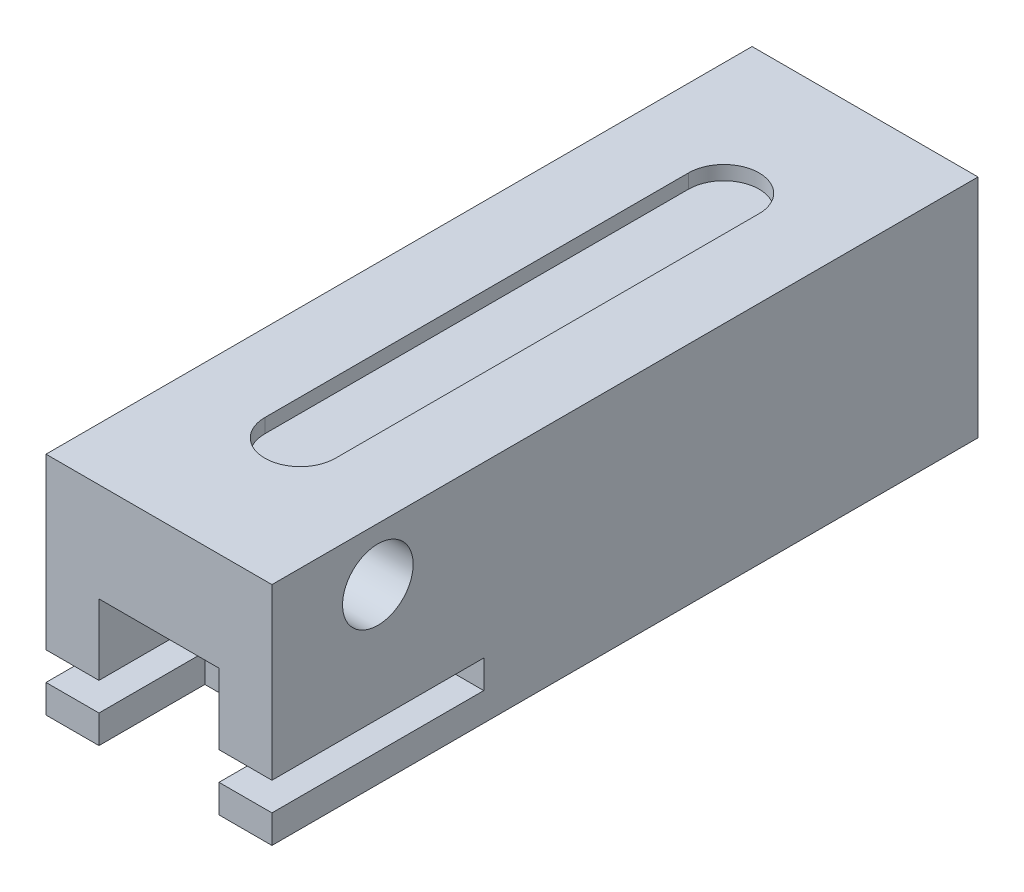
ISO-10303-21;
HEADER;
FILE_DESCRIPTION(('STEP AP214'),'2;1');
FILE_NAME('part.step','',(''),(''),'','','');
FILE_SCHEMA(('AUTOMOTIVE_DESIGN { 1 0 10303 214 1 1 1 1 }'));
ENDSEC;
DATA;
#1=APPLICATION_CONTEXT('core data for automotive mechanical design processes');
#2=APPLICATION_PROTOCOL_DEFINITION('international standard','automotive_design',2000,#1);
#3=PRODUCT_CONTEXT('',#1,'mechanical');
#4=PRODUCT('Part','Part','',(#3));
#5=PRODUCT_RELATED_PRODUCT_CATEGORY('part','',(#4));
#6=PRODUCT_DEFINITION_FORMATION('','',#4);
#7=PRODUCT_DEFINITION_CONTEXT('part definition',#1,'design');
#8=PRODUCT_DEFINITION('design','',#6,#7);
#9=PRODUCT_DEFINITION_SHAPE('','',#8);
#10=(LENGTH_UNIT() NAMED_UNIT(*) SI_UNIT(.MILLI.,.METRE.));
#11=(NAMED_UNIT(*) PLANE_ANGLE_UNIT() SI_UNIT($,.RADIAN.));
#12=(NAMED_UNIT(*) SI_UNIT($,.STERADIAN.) SOLID_ANGLE_UNIT());
#13=UNCERTAINTY_MEASURE_WITH_UNIT(LENGTH_MEASURE(1.E-05),#10,'distance_accuracy_value','');
#14=(GEOMETRIC_REPRESENTATION_CONTEXT(3) GLOBAL_UNCERTAINTY_ASSIGNED_CONTEXT((#13)) GLOBAL_UNIT_ASSIGNED_CONTEXT((#10,
#11,#12)) REPRESENTATION_CONTEXT('',''));
#15=CARTESIAN_POINT('',(0.,0.,0.));
#16=DIRECTION('',(0.,0.,1.));
#17=DIRECTION('',(1.,0.,0.));
#18=AXIS2_PLACEMENT_3D('',#15,#16,#17);
#19=CARTESIAN_POINT('',(-16.,-16.,-100.));
#20=DIRECTION('',(0.,-1.,0.));
#21=DIRECTION('',(0.,0.,-1.));
#22=AXIS2_PLACEMENT_3D('',#19,#20,#21);
#23=PLANE('',#22);
#24=DIRECTION('',(1.,0.,0.));
#25=VECTOR('',#24,1.);
#26=CARTESIAN_POINT('',(-16.,-16.,0.));
#27=LINE('',#26,#25);
#28=CARTESIAN_POINT('',(8.5,-16.,0.));
#29=VERTEX_POINT('',#28);
#30=CARTESIAN_POINT('',(16.,-16.,0.));
#31=VERTEX_POINT('',#30);
#32=EDGE_CURVE('E318',#29,#31,#27,.T.);
#33=ORIENTED_EDGE('',*,*,#32,.F.);
#34=DIRECTION('',(0.,0.,-1.));
#35=VECTOR('',#34,1.);
#36=CARTESIAN_POINT('',(8.5,-16.,-100.));
#37=LINE('',#36,#35);
#38=CARTESIAN_POINT('',(8.5,-16.,-15.));
#39=VERTEX_POINT('',#38);
#40=EDGE_CURVE('E208',#29,#39,#37,.T.);
#41=ORIENTED_EDGE('',*,*,#40,.T.);
#42=DIRECTION('',(-1.,0.,0.));
#43=VECTOR('',#42,1.);
#44=CARTESIAN_POINT('',(-16.,-16.,-15.));
#45=LINE('',#44,#43);
#46=CARTESIAN_POINT('',(-8.5,-16.,-15.));
#47=VERTEX_POINT('',#46);
#48=EDGE_CURVE('E201',#39,#47,#45,.T.);
#49=ORIENTED_EDGE('',*,*,#48,.T.);
#50=DIRECTION('',(0.,0.,-1.));
#51=VECTOR('',#50,1.);
#52=CARTESIAN_POINT('',(-8.5,-16.,-100.));
#53=LINE('',#52,#51);
#54=CARTESIAN_POINT('',(-8.5,-16.,0.));
#55=VERTEX_POINT('',#54);
#56=EDGE_CURVE('E194',#55,#47,#53,.T.);
#57=ORIENTED_EDGE('',*,*,#56,.F.);
#58=CARTESIAN_POINT('',(-16.,-16.,0.));
#59=VERTEX_POINT('',#58);
#60=EDGE_CURVE('E299',#59,#55,#27,.T.);
#61=ORIENTED_EDGE('',*,*,#60,.F.);
#62=DIRECTION('',(0.,0.,1.));
#63=VECTOR('',#62,1.);
#64=CARTESIAN_POINT('',(-16.,-16.,-100.));
#65=LINE('',#64,#63);
#66=CARTESIAN_POINT('',(-16.,-16.,-100.));
#67=VERTEX_POINT('',#66);
#68=EDGE_CURVE('E46',#67,#59,#65,.T.);
#69=ORIENTED_EDGE('',*,*,#68,.F.);
#70=DIRECTION('',(1.,0.,0.));
#71=VECTOR('',#70,1.);
#72=CARTESIAN_POINT('',(-16.,-16.,-100.));
#73=LINE('',#72,#71);
#74=CARTESIAN_POINT('',(16.,-16.,-100.));
#75=VERTEX_POINT('',#74);
#76=EDGE_CURVE('E305',#67,#75,#73,.T.);
#77=ORIENTED_EDGE('',*,*,#76,.T.);
#78=DIRECTION('',(0.,0.,1.));
#79=VECTOR('',#78,1.);
#80=CARTESIAN_POINT('',(16.,-16.,-100.));
#81=LINE('',#80,#79);
#82=EDGE_CURVE('E11',#75,#31,#81,.T.);
#83=ORIENTED_EDGE('',*,*,#82,.T.);
#84=EDGE_LOOP('',(#33,#41,#49,#57,#61,#69,#77,#83));
#85=FACE_BOUND('',#84,.T.);
#86=ADVANCED_FACE('F37',(#85),#23,.T.);
#87=CARTESIAN_POINT('',(0.,0.,0.));
#88=DIRECTION('',(0.,0.,-1.));
#89=DIRECTION('',(-1.,0.,0.));
#90=AXIS2_PLACEMENT_3D('',#87,#88,#89);
#91=PLANE('',#90);
#92=DIRECTION('',(0.,-1.,0.));
#93=VECTOR('',#92,1.);
#94=CARTESIAN_POINT('',(8.5,0.,0.));
#95=LINE('',#94,#93);
#96=CARTESIAN_POINT('',(8.5,-12.,0.));
#97=VERTEX_POINT('',#96);
#98=EDGE_CURVE('E187',#97,#29,#95,.T.);
#99=ORIENTED_EDGE('',*,*,#98,.T.);
#100=ORIENTED_EDGE('',*,*,#32,.T.);
#101=DIRECTION('',(0.,1.,0.));
#102=VECTOR('',#101,1.);
#103=CARTESIAN_POINT('',(16.,-16.,0.));
#104=LINE('',#103,#102);
#105=CARTESIAN_POINT('',(16.,-12.,0.));
#106=VERTEX_POINT('',#105);
#107=EDGE_CURVE('E308',#31,#106,#104,.T.);
#108=ORIENTED_EDGE('',*,*,#107,.T.);
#109=DIRECTION('',(1.,0.,0.));
#110=VECTOR('',#109,1.);
#111=CARTESIAN_POINT('',(0.,-12.,0.));
#112=LINE('',#111,#110);
#113=EDGE_CURVE('E237',#97,#106,#112,.T.);
#114=ORIENTED_EDGE('',*,*,#113,.F.);
#115=EDGE_LOOP('',(#99,#100,#108,#114));
#116=FACE_BOUND('',#115,.T.);
#117=ADVANCED_FACE('F354',(#116),#91,.F.);
#118=CARTESIAN_POINT('',(0.,-12.,-30.));
#119=DIRECTION('',(0.,-1.,0.));
#120=DIRECTION('',(0.,0.,-1.));
#121=AXIS2_PLACEMENT_3D('',#118,#119,#120);
#122=PLANE('',#121);
#123=DIRECTION('',(0.,0.,1.));
#124=VECTOR('',#123,1.);
#125=CARTESIAN_POINT('',(8.5,-12.,-15.));
#126=LINE('',#125,#124);
#127=CARTESIAN_POINT('',(8.5,-12.,-15.));
#128=VERTEX_POINT('',#127);
#129=EDGE_CURVE('E54',#128,#97,#126,.T.);
#130=ORIENTED_EDGE('',*,*,#129,.T.);
#131=ORIENTED_EDGE('',*,*,#113,.T.);
#132=DIRECTION('',(0.,0.,1.));
#133=VECTOR('',#132,1.);
#134=CARTESIAN_POINT('',(16.,-12.,-30.));
#135=LINE('',#134,#133);
#136=CARTESIAN_POINT('',(16.,-12.,-30.));
#137=VERTEX_POINT('',#136);
#138=EDGE_CURVE('E254',#137,#106,#135,.T.);
#139=ORIENTED_EDGE('',*,*,#138,.F.);
#140=DIRECTION('',(1.,0.,0.));
#141=VECTOR('',#140,1.);
#142=CARTESIAN_POINT('',(0.,-12.,-30.));
#143=LINE('',#142,#141);
#144=CARTESIAN_POINT('',(-16.,-12.,-30.));
#145=VERTEX_POINT('',#144);
#146=EDGE_CURVE('E221',#145,#137,#143,.T.);
#147=ORIENTED_EDGE('',*,*,#146,.F.);
#148=DIRECTION('',(0.,0.,1.));
#149=VECTOR('',#148,1.);
#150=CARTESIAN_POINT('',(-16.,-12.,-30.));
#151=LINE('',#150,#149);
#152=CARTESIAN_POINT('',(-16.,-12.,0.));
#153=VERTEX_POINT('',#152);
#154=EDGE_CURVE('E257',#145,#153,#151,.T.);
#155=ORIENTED_EDGE('',*,*,#154,.T.);
#156=CARTESIAN_POINT('',(-8.5,-12.,0.));
#157=VERTEX_POINT('',#156);
#158=EDGE_CURVE('E199',#153,#157,#112,.T.);
#159=ORIENTED_EDGE('',*,*,#158,.T.);
#160=DIRECTION('',(0.,0.,1.));
#161=VECTOR('',#160,1.);
#162=CARTESIAN_POINT('',(-8.5,-12.,-15.));
#163=LINE('',#162,#161);
#164=CARTESIAN_POINT('',(-8.5,-12.,-15.));
#165=VERTEX_POINT('',#164);
#166=EDGE_CURVE('E191',#165,#157,#163,.T.);
#167=ORIENTED_EDGE('',*,*,#166,.F.);
#168=DIRECTION('',(1.,0.,0.));
#169=VECTOR('',#168,1.);
#170=CARTESIAN_POINT('',(0.,-12.,-15.));
#171=LINE('',#170,#169);
#172=EDGE_CURVE('E179',#165,#128,#171,.T.);
#173=ORIENTED_EDGE('',*,*,#172,.T.);
#174=EDGE_LOOP('',(#130,#131,#139,#147,#155,#159,#167,#173));
#175=FACE_BOUND('',#174,.T.);
#176=ADVANCED_FACE('F197',(#175),#122,.F.);
#177=CARTESIAN_POINT('',(16.,-16.,-100.));
#178=DIRECTION('',(1.,0.,0.));
#179=DIRECTION('',(0.,0.,-1.));
#180=AXIS2_PLACEMENT_3D('',#177,#178,#179);
#181=PLANE('',#180);
#182=CARTESIAN_POINT('',(16.,8.5,-15.));
#183=DIRECTION('',(1.,0.,0.));
#184=DIRECTION('',(0.,0.,-1.));
#185=AXIS2_PLACEMENT_3D('',#182,#183,#184);
#186=CIRCLE('',#185,5.);
#187=CARTESIAN_POINT('',(16.,8.5,-20.));
#188=VERTEX_POINT('',#187);
#189=EDGE_CURVE('E415',#188,#188,#186,.T.);
#190=ORIENTED_EDGE('',*,*,#189,.F.);
#191=EDGE_LOOP('',(#190));
#192=FACE_BOUND('',#191,.T.);
#193=CARTESIAN_POINT('',(16.,-8.,0.));
#194=VERTEX_POINT('',#193);
#195=CARTESIAN_POINT('',(16.,16.,0.));
#196=VERTEX_POINT('',#195);
#197=EDGE_CURVE('E294',#194,#196,#104,.T.);
#198=ORIENTED_EDGE('',*,*,#197,.F.);
#199=DIRECTION('',(0.,0.,1.));
#200=VECTOR('',#199,1.);
#201=CARTESIAN_POINT('',(16.,-8.,-30.));
#202=LINE('',#201,#200);
#203=CARTESIAN_POINT('',(16.,-8.,-30.));
#204=VERTEX_POINT('',#203);
#205=EDGE_CURVE('E252',#204,#194,#202,.T.);
#206=ORIENTED_EDGE('',*,*,#205,.F.);
#207=DIRECTION('',(0.,-1.,0.));
#208=VECTOR('',#207,1.);
#209=CARTESIAN_POINT('',(16.,0.,-30.));
#210=LINE('',#209,#208);
#211=EDGE_CURVE('E224',#204,#137,#210,.T.);
#212=ORIENTED_EDGE('',*,*,#211,.T.);
#213=ORIENTED_EDGE('',*,*,#138,.T.);
#214=ORIENTED_EDGE('',*,*,#107,.F.);
#215=ORIENTED_EDGE('',*,*,#82,.F.);
#216=DIRECTION('',(0.,1.,0.));
#217=VECTOR('',#216,1.);
#218=CARTESIAN_POINT('',(16.,-16.,-100.));
#219=LINE('',#218,#217);
#220=CARTESIAN_POINT('',(16.,16.,-100.));
#221=VERTEX_POINT('',#220);
#222=EDGE_CURVE('E295',#75,#221,#219,.T.);
#223=ORIENTED_EDGE('',*,*,#222,.T.);
#224=DIRECTION('',(0.,0.,1.));
#225=VECTOR('',#224,1.);
#226=CARTESIAN_POINT('',(16.,16.,-100.));
#227=LINE('',#226,#225);
#228=EDGE_CURVE('E41',#221,#196,#227,.T.);
#229=ORIENTED_EDGE('',*,*,#228,.T.);
#230=EDGE_LOOP('',(#198,#206,#212,#213,#214,#215,#223,#229));
#231=FACE_BOUND('',#230,.T.);
#232=ADVANCED_FACE('F39',(#192,#231),#181,.T.);
#233=DIRECTION('',(1.,0.,0.));
#234=VECTOR('',#233,1.);
#235=CARTESIAN_POINT('',(0.,-8.,0.));
#236=LINE('',#235,#234);
#237=CARTESIAN_POINT('',(8.5,-8.,0.));
#238=VERTEX_POINT('',#237);
#239=EDGE_CURVE('E238',#238,#194,#236,.T.);
#240=ORIENTED_EDGE('',*,*,#239,.T.);
#241=ORIENTED_EDGE('',*,*,#197,.T.);
#242=DIRECTION('',(-1.,0.,0.));
#243=VECTOR('',#242,1.);
#244=CARTESIAN_POINT('',(-16.,16.,0.));
#245=LINE('',#244,#243);
#246=CARTESIAN_POINT('',(-16.,16.,0.));
#247=VERTEX_POINT('',#246);
#248=EDGE_CURVE('E311',#196,#247,#245,.T.);
#249=ORIENTED_EDGE('',*,*,#248,.T.);
#250=DIRECTION('',(0.,-1.,0.));
#251=VECTOR('',#250,1.);
#252=CARTESIAN_POINT('',(-16.,-16.,0.));
#253=LINE('',#252,#251);
#254=CARTESIAN_POINT('',(-16.,-8.,0.));
#255=VERTEX_POINT('',#254);
#256=EDGE_CURVE('E315',#247,#255,#253,.T.);
#257=ORIENTED_EDGE('',*,*,#256,.T.);
#258=CARTESIAN_POINT('',(-8.5,-8.,0.));
#259=VERTEX_POINT('',#258);
#260=EDGE_CURVE('E234',#255,#259,#236,.T.);
#261=ORIENTED_EDGE('',*,*,#260,.T.);
#262=DIRECTION('',(0.,1.,0.));
#263=VECTOR('',#262,1.);
#264=CARTESIAN_POINT('',(-8.5,0.,0.));
#265=LINE('',#264,#263);
#266=CARTESIAN_POINT('',(-8.5,2.,0.));
#267=VERTEX_POINT('',#266);
#268=EDGE_CURVE('E62',#259,#267,#265,.T.);
#269=ORIENTED_EDGE('',*,*,#268,.T.);
#270=DIRECTION('',(1.,0.,0.));
#271=VECTOR('',#270,1.);
#272=CARTESIAN_POINT('',(0.,2.,0.));
#273=LINE('',#272,#271);
#274=CARTESIAN_POINT('',(8.5,2.,0.));
#275=VERTEX_POINT('',#274);
#276=EDGE_CURVE('E215',#267,#275,#273,.T.);
#277=ORIENTED_EDGE('',*,*,#276,.T.);
#278=DIRECTION('',(0.,1.,0.));
#279=VECTOR('',#278,1.);
#280=CARTESIAN_POINT('',(8.5,0.,0.));
#281=LINE('',#280,#279);
#282=EDGE_CURVE('E240',#238,#275,#281,.T.);
#283=ORIENTED_EDGE('',*,*,#282,.F.);
#284=EDGE_LOOP('',(#240,#241,#249,#257,#261,#269,#277,#283));
#285=FACE_BOUND('',#284,.T.);
#286=ADVANCED_FACE('F336',(#285),#91,.F.);
#287=CARTESIAN_POINT('',(-16.,16.,-100.));
#288=DIRECTION('',(0.,1.,0.));
#289=DIRECTION('',(0.,0.,1.));
#290=AXIS2_PLACEMENT_3D('',#287,#288,#289);
#291=PLANE('',#290);
#292=ORIENTED_EDGE('',*,*,#248,.F.);
#293=ORIENTED_EDGE('',*,*,#228,.F.);
#294=DIRECTION('',(-1.,0.,0.));
#295=VECTOR('',#294,1.);
#296=CARTESIAN_POINT('',(-16.,16.,-100.));
#297=LINE('',#296,#295);
#298=CARTESIAN_POINT('',(-16.,16.,-100.));
#299=VERTEX_POINT('',#298);
#300=EDGE_CURVE('E298',#221,#299,#297,.T.);
#301=ORIENTED_EDGE('',*,*,#300,.T.);
#302=DIRECTION('',(0.,0.,1.));
#303=VECTOR('',#302,1.);
#304=CARTESIAN_POINT('',(-16.,16.,-100.));
#305=LINE('',#304,#303);
#306=EDGE_CURVE('E322',#299,#247,#305,.T.);
#307=ORIENTED_EDGE('',*,*,#306,.T.);
#308=EDGE_LOOP('',(#292,#293,#301,#307));
#309=FACE_BOUND('',#308,.T.);
#310=CARTESIAN_POINT('',(0.,16.,-20.));
#311=DIRECTION('',(0.,1.,0.));
#312=DIRECTION('',(0.,0.,1.));
#313=AXIS2_PLACEMENT_3D('',#310,#311,#312);
#314=CIRCLE('',#313,5.);
#315=CARTESIAN_POINT('',(-5.,16.,-20.));
#316=VERTEX_POINT('',#315);
#317=CARTESIAN_POINT('',(5.,16.,-20.));
#318=VERTEX_POINT('',#317);
#319=EDGE_CURVE('E266',#316,#318,#314,.T.);
#320=ORIENTED_EDGE('',*,*,#319,.F.);
#321=DIRECTION('',(0.,0.,-1.));
#322=VECTOR('',#321,1.);
#323=CARTESIAN_POINT('',(-5.,16.,-100.));
#324=LINE('',#323,#322);
#325=CARTESIAN_POINT('',(-5.,16.,-80.));
#326=VERTEX_POINT('',#325);
#327=EDGE_CURVE('E247',#316,#326,#324,.T.);
#328=ORIENTED_EDGE('',*,*,#327,.T.);
#329=CARTESIAN_POINT('',(0.,16.,-80.));
#330=DIRECTION('',(0.,1.,0.));
#331=DIRECTION('',(0.,0.,1.));
#332=AXIS2_PLACEMENT_3D('',#329,#330,#331);
#333=CIRCLE('',#332,5.);
#334=CARTESIAN_POINT('',(5.,16.,-80.));
#335=VERTEX_POINT('',#334);
#336=EDGE_CURVE('E278',#335,#326,#333,.T.);
#337=ORIENTED_EDGE('',*,*,#336,.F.);
#338=DIRECTION('',(0.,0.,-1.));
#339=VECTOR('',#338,1.);
#340=CARTESIAN_POINT('',(5.,16.,-100.));
#341=LINE('',#340,#339);
#342=EDGE_CURVE('E281',#318,#335,#341,.T.);
#343=ORIENTED_EDGE('',*,*,#342,.F.);
#344=EDGE_LOOP('',(#320,#328,#337,#343));
#345=FACE_BOUND('',#344,.T.);
#346=ADVANCED_FACE('F332',(#309,#345),#291,.T.);
#347=CARTESIAN_POINT('',(-16.,-16.,-100.));
#348=DIRECTION('',(-1.,0.,0.));
#349=DIRECTION('',(0.,0.,1.));
#350=AXIS2_PLACEMENT_3D('',#347,#348,#349);
#351=PLANE('',#350);
#352=CARTESIAN_POINT('',(-16.,8.5,-15.));
#353=DIRECTION('',(1.,0.,0.));
#354=DIRECTION('',(0.,0.,-1.));
#355=AXIS2_PLACEMENT_3D('',#352,#353,#354);
#356=CIRCLE('',#355,5.);
#357=CARTESIAN_POINT('',(-16.,8.5,-20.));
#358=VERTEX_POINT('',#357);
#359=EDGE_CURVE('E412',#358,#358,#356,.T.);
#360=ORIENTED_EDGE('',*,*,#359,.T.);
#361=EDGE_LOOP('',(#360));
#362=FACE_BOUND('',#361,.T.);
#363=ORIENTED_EDGE('',*,*,#154,.F.);
#364=DIRECTION('',(0.,-1.,0.));
#365=VECTOR('',#364,1.);
#366=CARTESIAN_POINT('',(-16.,0.,-30.));
#367=LINE('',#366,#365);
#368=CARTESIAN_POINT('',(-16.,-8.,-30.));
#369=VERTEX_POINT('',#368);
#370=EDGE_CURVE('E217',#369,#145,#367,.T.);
#371=ORIENTED_EDGE('',*,*,#370,.F.);
#372=DIRECTION('',(0.,0.,1.));
#373=VECTOR('',#372,1.);
#374=CARTESIAN_POINT('',(-16.,-8.,-30.));
#375=LINE('',#374,#373);
#376=EDGE_CURVE('E259',#369,#255,#375,.T.);
#377=ORIENTED_EDGE('',*,*,#376,.T.);
#378=ORIENTED_EDGE('',*,*,#256,.F.);
#379=ORIENTED_EDGE('',*,*,#306,.F.);
#380=DIRECTION('',(0.,-1.,0.));
#381=VECTOR('',#380,1.);
#382=CARTESIAN_POINT('',(-16.,-16.,-100.));
#383=LINE('',#382,#381);
#384=EDGE_CURVE('E302',#299,#67,#383,.T.);
#385=ORIENTED_EDGE('',*,*,#384,.T.);
#386=ORIENTED_EDGE('',*,*,#68,.T.);
#387=EDGE_CURVE('E314',#153,#59,#253,.T.);
#388=ORIENTED_EDGE('',*,*,#387,.F.);
#389=EDGE_LOOP('',(#363,#371,#377,#378,#379,#385,#386,#388));
#390=FACE_BOUND('',#389,.T.);
#391=ADVANCED_FACE('F364',(#362,#390),#351,.T.);
#392=CARTESIAN_POINT('',(0.,0.,-100.));
#393=DIRECTION('',(0.,0.,-1.));
#394=DIRECTION('',(-1.,0.,0.));
#395=AXIS2_PLACEMENT_3D('',#392,#393,#394);
#396=PLANE('',#395);
#397=ORIENTED_EDGE('',*,*,#222,.F.);
#398=ORIENTED_EDGE('',*,*,#76,.F.);
#399=ORIENTED_EDGE('',*,*,#384,.F.);
#400=ORIENTED_EDGE('',*,*,#300,.F.);
#401=EDGE_LOOP('',(#397,#398,#399,#400));
#402=FACE_BOUND('',#401,.T.);
#403=ADVANCED_FACE('F359',(#402),#396,.T.);
#404=ORIENTED_EDGE('',*,*,#60,.T.);
#405=DIRECTION('',(0.,-1.,0.));
#406=VECTOR('',#405,1.);
#407=CARTESIAN_POINT('',(-8.5,0.,0.));
#408=LINE('',#407,#406);
#409=EDGE_CURVE('E411',#157,#55,#408,.T.);
#410=ORIENTED_EDGE('',*,*,#409,.F.);
#411=ORIENTED_EDGE('',*,*,#158,.F.);
#412=ORIENTED_EDGE('',*,*,#387,.T.);
#413=EDGE_LOOP('',(#404,#410,#411,#412));
#414=FACE_BOUND('',#413,.T.);
#415=ADVANCED_FACE('F388',(#414),#91,.F.);
#416=CARTESIAN_POINT('',(-5.,14.,-100.));
#417=DIRECTION('',(1.,0.,0.));
#418=DIRECTION('',(0.,0.,-1.));
#419=AXIS2_PLACEMENT_3D('',#416,#417,#418);
#420=PLANE('',#419);
#421=ORIENTED_EDGE('',*,*,#327,.F.);
#422=DIRECTION('',(0.,1.,0.));
#423=VECTOR('',#422,1.);
#424=CARTESIAN_POINT('',(-5.,14.,-20.));
#425=LINE('',#424,#423);
#426=CARTESIAN_POINT('',(-5.,14.,-20.));
#427=VERTEX_POINT('',#426);
#428=EDGE_CURVE('E275',#427,#316,#425,.T.);
#429=ORIENTED_EDGE('',*,*,#428,.F.);
#430=DIRECTION('',(0.,0.,-1.));
#431=VECTOR('',#430,1.);
#432=CARTESIAN_POINT('',(-5.,14.,-100.));
#433=LINE('',#432,#431);
#434=CARTESIAN_POINT('',(-5.,14.,-80.));
#435=VERTEX_POINT('',#434);
#436=EDGE_CURVE('E263',#427,#435,#433,.T.);
#437=ORIENTED_EDGE('',*,*,#436,.T.);
#438=DIRECTION('',(0.,1.,0.));
#439=VECTOR('',#438,1.);
#440=CARTESIAN_POINT('',(-5.,14.,-80.));
#441=LINE('',#440,#439);
#442=EDGE_CURVE('E292',#435,#326,#441,.T.);
#443=ORIENTED_EDGE('',*,*,#442,.T.);
#444=EDGE_LOOP('',(#421,#429,#437,#443));
#445=FACE_BOUND('',#444,.T.);
#446=ADVANCED_FACE('F402',(#445),#420,.T.);
#447=CARTESIAN_POINT('',(0.,14.,-80.));
#448=DIRECTION('',(0.,1.,0.));
#449=DIRECTION('',(0.,0.,1.));
#450=AXIS2_PLACEMENT_3D('',#447,#448,#449);
#451=CYLINDRICAL_SURFACE('',#450,5.);
#452=ORIENTED_EDGE('',*,*,#336,.T.);
#453=ORIENTED_EDGE('',*,*,#442,.F.);
#454=CARTESIAN_POINT('',(0.,14.,-80.));
#455=DIRECTION('',(0.,1.,0.));
#456=DIRECTION('',(0.,0.,1.));
#457=AXIS2_PLACEMENT_3D('',#454,#455,#456);
#458=CIRCLE('',#457,5.);
#459=CARTESIAN_POINT('',(5.,14.,-80.));
#460=VERTEX_POINT('',#459);
#461=EDGE_CURVE('E265',#460,#435,#458,.T.);
#462=ORIENTED_EDGE('',*,*,#461,.F.);
#463=DIRECTION('',(0.,1.,0.));
#464=VECTOR('',#463,1.);
#465=CARTESIAN_POINT('',(5.,14.,-80.));
#466=LINE('',#465,#464);
#467=EDGE_CURVE('E290',#460,#335,#466,.T.);
#468=ORIENTED_EDGE('',*,*,#467,.T.);
#469=EDGE_LOOP('',(#452,#453,#462,#468));
#470=FACE_BOUND('',#469,.T.);
#471=ADVANCED_FACE('F408',(#470),#451,.F.);
#472=CARTESIAN_POINT('',(5.,14.,-100.));
#473=DIRECTION('',(1.,0.,0.));
#474=DIRECTION('',(0.,0.,-1.));
#475=AXIS2_PLACEMENT_3D('',#472,#473,#474);
#476=PLANE('',#475);
#477=ORIENTED_EDGE('',*,*,#342,.T.);
#478=ORIENTED_EDGE('',*,*,#467,.F.);
#479=DIRECTION('',(0.,0.,-1.));
#480=VECTOR('',#479,1.);
#481=CARTESIAN_POINT('',(5.,14.,-100.));
#482=LINE('',#481,#480);
#483=CARTESIAN_POINT('',(5.,14.,-20.));
#484=VERTEX_POINT('',#483);
#485=EDGE_CURVE('E269',#484,#460,#482,.T.);
#486=ORIENTED_EDGE('',*,*,#485,.F.);
#487=DIRECTION('',(0.,1.,0.));
#488=VECTOR('',#487,1.);
#489=CARTESIAN_POINT('',(5.,14.,-20.));
#490=LINE('',#489,#488);
#491=EDGE_CURVE('E288',#484,#318,#490,.T.);
#492=ORIENTED_EDGE('',*,*,#491,.T.);
#493=EDGE_LOOP('',(#477,#478,#486,#492));
#494=FACE_BOUND('',#493,.T.);
#495=ADVANCED_FACE('F454',(#494),#476,.F.);
#496=CARTESIAN_POINT('',(0.,14.,-20.));
#497=DIRECTION('',(0.,1.,0.));
#498=DIRECTION('',(0.,0.,1.));
#499=AXIS2_PLACEMENT_3D('',#496,#497,#498);
#500=CYLINDRICAL_SURFACE('',#499,5.);
#501=ORIENTED_EDGE('',*,*,#319,.T.);
#502=ORIENTED_EDGE('',*,*,#491,.F.);
#503=CARTESIAN_POINT('',(0.,14.,-20.));
#504=DIRECTION('',(0.,1.,0.));
#505=DIRECTION('',(0.,0.,1.));
#506=AXIS2_PLACEMENT_3D('',#503,#504,#505);
#507=CIRCLE('',#506,5.);
#508=EDGE_CURVE('E272',#427,#484,#507,.T.);
#509=ORIENTED_EDGE('',*,*,#508,.F.);
#510=ORIENTED_EDGE('',*,*,#428,.T.);
#511=EDGE_LOOP('',(#501,#502,#509,#510));
#512=FACE_BOUND('',#511,.T.);
#513=ADVANCED_FACE('F450',(#512),#500,.F.);
#514=CARTESIAN_POINT('',(0.,14.,-80.));
#515=DIRECTION('',(0.,1.,0.));
#516=DIRECTION('',(0.,0.,1.));
#517=AXIS2_PLACEMENT_3D('',#514,#515,#516);
#518=PLANE('',#517);
#519=ORIENTED_EDGE('',*,*,#436,.F.);
#520=ORIENTED_EDGE('',*,*,#508,.T.);
#521=ORIENTED_EDGE('',*,*,#485,.T.);
#522=ORIENTED_EDGE('',*,*,#461,.T.);
#523=EDGE_LOOP('',(#519,#520,#521,#522));
#524=FACE_BOUND('',#523,.T.);
#525=ADVANCED_FACE('F447',(#524),#518,.T.);
#526=CARTESIAN_POINT('',(-8.5,0.,-30.));
#527=DIRECTION('',(1.,0.,0.));
#528=DIRECTION('',(0.,0.,-1.));
#529=AXIS2_PLACEMENT_3D('',#526,#527,#528);
#530=PLANE('',#529);
#531=ORIENTED_EDGE('',*,*,#268,.F.);
#532=DIRECTION('',(0.,0.,1.));
#533=VECTOR('',#532,1.);
#534=CARTESIAN_POINT('',(-8.5,-8.,-30.));
#535=LINE('',#534,#533);
#536=CARTESIAN_POINT('',(-8.5,-8.,-30.));
#537=VERTEX_POINT('',#536);
#538=EDGE_CURVE('E232',#537,#259,#535,.T.);
#539=ORIENTED_EDGE('',*,*,#538,.F.);
#540=DIRECTION('',(0.,1.,0.));
#541=VECTOR('',#540,1.);
#542=CARTESIAN_POINT('',(-8.5,0.,-30.));
#543=LINE('',#542,#541);
#544=CARTESIAN_POINT('',(-8.5,2.,-30.));
#545=VERTEX_POINT('',#544);
#546=EDGE_CURVE('E211',#537,#545,#543,.T.);
#547=ORIENTED_EDGE('',*,*,#546,.T.);
#548=DIRECTION('',(0.,0.,1.));
#549=VECTOR('',#548,1.);
#550=CARTESIAN_POINT('',(-8.5,2.,-30.));
#551=LINE('',#550,#549);
#552=EDGE_CURVE('E245',#545,#267,#551,.T.);
#553=ORIENTED_EDGE('',*,*,#552,.T.);
#554=EDGE_LOOP('',(#531,#539,#547,#553));
#555=FACE_BOUND('',#554,.T.);
#556=ADVANCED_FACE('F368',(#555),#530,.T.);
#557=CARTESIAN_POINT('',(0.,2.,-30.));
#558=DIRECTION('',(0.,-1.,0.));
#559=DIRECTION('',(0.,0.,-1.));
#560=AXIS2_PLACEMENT_3D('',#557,#558,#559);
#561=PLANE('',#560);
#562=ORIENTED_EDGE('',*,*,#276,.F.);
#563=ORIENTED_EDGE('',*,*,#552,.F.);
#564=DIRECTION('',(1.,0.,0.));
#565=VECTOR('',#564,1.);
#566=CARTESIAN_POINT('',(0.,2.,-30.));
#567=LINE('',#566,#565);
#568=CARTESIAN_POINT('',(8.5,2.,-30.));
#569=VERTEX_POINT('',#568);
#570=EDGE_CURVE('E230',#545,#569,#567,.T.);
#571=ORIENTED_EDGE('',*,*,#570,.T.);
#572=DIRECTION('',(0.,0.,1.));
#573=VECTOR('',#572,1.);
#574=CARTESIAN_POINT('',(8.5,2.,-30.));
#575=LINE('',#574,#573);
#576=EDGE_CURVE('E248',#569,#275,#575,.T.);
#577=ORIENTED_EDGE('',*,*,#576,.T.);
#578=EDGE_LOOP('',(#562,#563,#571,#577));
#579=FACE_BOUND('',#578,.T.);
#580=ADVANCED_FACE('F370',(#579),#561,.T.);
#581=CARTESIAN_POINT('',(8.5,0.,-30.));
#582=DIRECTION('',(1.,0.,0.));
#583=DIRECTION('',(0.,0.,-1.));
#584=AXIS2_PLACEMENT_3D('',#581,#582,#583);
#585=PLANE('',#584);
#586=ORIENTED_EDGE('',*,*,#282,.T.);
#587=ORIENTED_EDGE('',*,*,#576,.F.);
#588=DIRECTION('',(0.,1.,0.));
#589=VECTOR('',#588,1.);
#590=CARTESIAN_POINT('',(8.5,0.,-30.));
#591=LINE('',#590,#589);
#592=CARTESIAN_POINT('',(8.5,-8.,-30.));
#593=VERTEX_POINT('',#592);
#594=EDGE_CURVE('E227',#593,#569,#591,.T.);
#595=ORIENTED_EDGE('',*,*,#594,.F.);
#596=DIRECTION('',(0.,0.,1.));
#597=VECTOR('',#596,1.);
#598=CARTESIAN_POINT('',(8.5,-8.,-30.));
#599=LINE('',#598,#597);
#600=EDGE_CURVE('E250',#593,#238,#599,.T.);
#601=ORIENTED_EDGE('',*,*,#600,.T.);
#602=EDGE_LOOP('',(#586,#587,#595,#601));
#603=FACE_BOUND('',#602,.T.);
#604=ADVANCED_FACE('F373',(#603),#585,.F.);
#605=CARTESIAN_POINT('',(0.,-8.,-30.));
#606=DIRECTION('',(0.,-1.,0.));
#607=DIRECTION('',(0.,0.,-1.));
#608=AXIS2_PLACEMENT_3D('',#605,#606,#607);
#609=PLANE('',#608);
#610=ORIENTED_EDGE('',*,*,#239,.F.);
#611=ORIENTED_EDGE('',*,*,#600,.F.);
#612=DIRECTION('',(1.,0.,0.));
#613=VECTOR('',#612,1.);
#614=CARTESIAN_POINT('',(0.,-8.,-30.));
#615=LINE('',#614,#613);
#616=EDGE_CURVE('E218',#593,#204,#615,.T.);
#617=ORIENTED_EDGE('',*,*,#616,.T.);
#618=ORIENTED_EDGE('',*,*,#205,.T.);
#619=EDGE_LOOP('',(#610,#611,#617,#618));
#620=FACE_BOUND('',#619,.T.);
#621=ADVANCED_FACE('F340',(#620),#609,.T.);
#622=ORIENTED_EDGE('',*,*,#260,.F.);
#623=ORIENTED_EDGE('',*,*,#376,.F.);
#624=EDGE_CURVE('E214',#369,#537,#615,.T.);
#625=ORIENTED_EDGE('',*,*,#624,.T.);
#626=ORIENTED_EDGE('',*,*,#538,.T.);
#627=EDGE_LOOP('',(#622,#623,#625,#626));
#628=FACE_BOUND('',#627,.T.);
#629=ADVANCED_FACE('F366',(#628),#609,.T.);
#630=CARTESIAN_POINT('',(0.,0.,-30.));
#631=DIRECTION('',(0.,0.,1.));
#632=DIRECTION('',(1.,0.,0.));
#633=AXIS2_PLACEMENT_3D('',#630,#631,#632);
#634=PLANE('',#633);
#635=ORIENTED_EDGE('',*,*,#546,.F.);
#636=ORIENTED_EDGE('',*,*,#624,.F.);
#637=ORIENTED_EDGE('',*,*,#370,.T.);
#638=ORIENTED_EDGE('',*,*,#146,.T.);
#639=ORIENTED_EDGE('',*,*,#211,.F.);
#640=ORIENTED_EDGE('',*,*,#616,.F.);
#641=ORIENTED_EDGE('',*,*,#594,.T.);
#642=ORIENTED_EDGE('',*,*,#570,.F.);
#643=EDGE_LOOP('',(#635,#636,#637,#638,#639,#640,#641,#642));
#644=FACE_BOUND('',#643,.T.);
#645=ADVANCED_FACE('F346',(#644),#634,.T.);
#646=CARTESIAN_POINT('',(8.5,0.,-15.));
#647=DIRECTION('',(-1.,0.,0.));
#648=DIRECTION('',(0.,0.,1.));
#649=AXIS2_PLACEMENT_3D('',#646,#647,#648);
#650=PLANE('',#649);
#651=ORIENTED_EDGE('',*,*,#98,.F.);
#652=ORIENTED_EDGE('',*,*,#129,.F.);
#653=DIRECTION('',(0.,-1.,0.));
#654=VECTOR('',#653,1.);
#655=CARTESIAN_POINT('',(8.5,0.,-15.));
#656=LINE('',#655,#654);
#657=EDGE_CURVE('E184',#128,#39,#656,.T.);
#658=ORIENTED_EDGE('',*,*,#657,.T.);
#659=ORIENTED_EDGE('',*,*,#40,.F.);
#660=EDGE_LOOP('',(#651,#652,#658,#659));
#661=FACE_BOUND('',#660,.T.);
#662=ADVANCED_FACE('F431',(#661),#650,.T.);
#663=CARTESIAN_POINT('',(-8.5,0.,-15.));
#664=DIRECTION('',(-1.,0.,0.));
#665=DIRECTION('',(0.,0.,1.));
#666=AXIS2_PLACEMENT_3D('',#663,#664,#665);
#667=PLANE('',#666);
#668=ORIENTED_EDGE('',*,*,#56,.T.);
#669=DIRECTION('',(0.,-1.,0.));
#670=VECTOR('',#669,1.);
#671=CARTESIAN_POINT('',(-8.5,0.,-15.));
#672=LINE('',#671,#670);
#673=EDGE_CURVE('E182',#165,#47,#672,.T.);
#674=ORIENTED_EDGE('',*,*,#673,.F.);
#675=ORIENTED_EDGE('',*,*,#166,.T.);
#676=ORIENTED_EDGE('',*,*,#409,.T.);
#677=EDGE_LOOP('',(#668,#674,#675,#676));
#678=FACE_BOUND('',#677,.T.);
#679=ADVANCED_FACE('F190',(#678),#667,.F.);
#680=CARTESIAN_POINT('',(0.,0.,-15.));
#681=DIRECTION('',(0.,0.,1.));
#682=DIRECTION('',(1.,0.,0.));
#683=AXIS2_PLACEMENT_3D('',#680,#681,#682);
#684=PLANE('',#683);
#685=ORIENTED_EDGE('',*,*,#657,.F.);
#686=ORIENTED_EDGE('',*,*,#172,.F.);
#687=ORIENTED_EDGE('',*,*,#673,.T.);
#688=ORIENTED_EDGE('',*,*,#48,.F.);
#689=EDGE_LOOP('',(#685,#686,#687,#688));
#690=FACE_BOUND('',#689,.T.);
#691=ADVANCED_FACE('F181',(#690),#684,.T.);
#692=CARTESIAN_POINT('',(-16.,8.5,-15.));
#693=DIRECTION('',(1.,0.,0.));
#694=DIRECTION('',(0.,0.,-1.));
#695=AXIS2_PLACEMENT_3D('',#692,#693,#694);
#696=CYLINDRICAL_SURFACE('',#695,5.);
#697=ORIENTED_EDGE('',*,*,#359,.F.);
#698=EDGE_LOOP('',(#697));
#699=FACE_BOUND('',#698,.T.);
#700=ORIENTED_EDGE('',*,*,#189,.T.);
#701=EDGE_LOOP('',(#700));
#702=FACE_BOUND('',#701,.T.);
#703=ADVANCED_FACE('F421',(#699,#702),#696,.F.);
#704=CLOSED_SHELL('',(#86,#117,#176,#232,#286,#346,#391,#403,#415,#446,#471,#495,#513,#525,#556,
#580,#604,#621,#629,#645,#662,#679,#691,#703));
#705=MANIFOLD_SOLID_BREP('B2',#704);
#706=ADVANCED_BREP_SHAPE_REPRESENTATION('',(#18,#705),#14);
#707=SHAPE_DEFINITION_REPRESENTATION(#9,#706);
ENDSEC;
END-ISO-10303-21;
